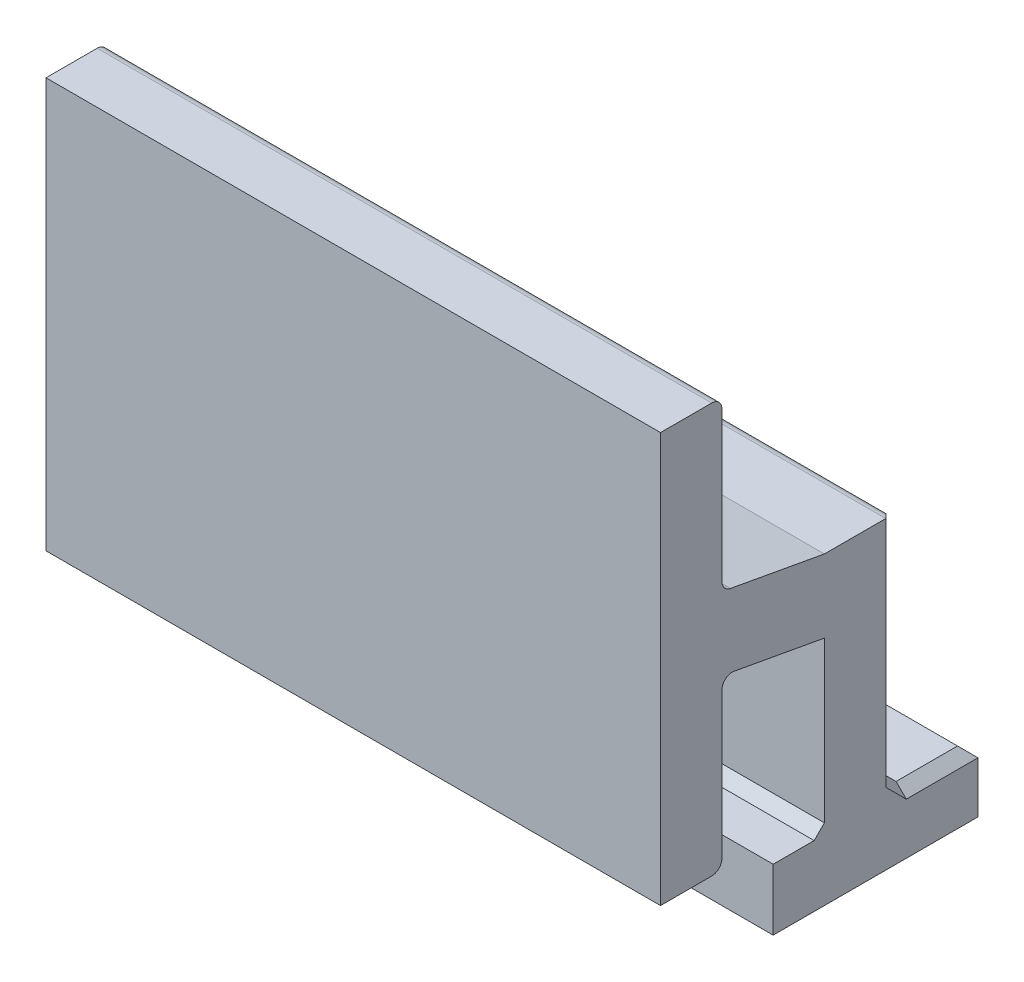
ISO-10303-21;
HEADER;
FILE_DESCRIPTION(('STEP AP214'),'2;1');
FILE_NAME('part.step','',(''),(''),'','','');
FILE_SCHEMA(('AUTOMOTIVE_DESIGN { 1 0 10303 214 1 1 1 1 }'));
ENDSEC;
DATA;
#1=APPLICATION_CONTEXT('core data for automotive mechanical design processes');
#2=APPLICATION_PROTOCOL_DEFINITION('international standard','automotive_design',2000,#1);
#3=PRODUCT_CONTEXT('',#1,'mechanical');
#4=PRODUCT('Part','Part','',(#3));
#5=PRODUCT_RELATED_PRODUCT_CATEGORY('part','',(#4));
#6=PRODUCT_DEFINITION_FORMATION('','',#4);
#7=PRODUCT_DEFINITION_CONTEXT('part definition',#1,'design');
#8=PRODUCT_DEFINITION('design','',#6,#7);
#9=PRODUCT_DEFINITION_SHAPE('','',#8);
#10=(LENGTH_UNIT() NAMED_UNIT(*) SI_UNIT(.MILLI.,.METRE.));
#11=(NAMED_UNIT(*) PLANE_ANGLE_UNIT() SI_UNIT($,.RADIAN.));
#12=(NAMED_UNIT(*) SI_UNIT($,.STERADIAN.) SOLID_ANGLE_UNIT());
#13=UNCERTAINTY_MEASURE_WITH_UNIT(LENGTH_MEASURE(1.E-05),#10,'distance_accuracy_value','');
#14=(GEOMETRIC_REPRESENTATION_CONTEXT(3) GLOBAL_UNCERTAINTY_ASSIGNED_CONTEXT((#13)) GLOBAL_UNIT_ASSIGNED_CONTEXT((#10,
#11,#12)) REPRESENTATION_CONTEXT('',''));
#15=CARTESIAN_POINT('',(0.,0.,0.));
#16=DIRECTION('',(0.,0.,1.));
#17=DIRECTION('',(1.,0.,0.));
#18=AXIS2_PLACEMENT_3D('',#15,#16,#17);
#19=CARTESIAN_POINT('',(30.,0.,5.));
#20=DIRECTION('',(0.,1.,0.));
#21=DIRECTION('',(0.,0.,1.));
#22=AXIS2_PLACEMENT_3D('',#19,#20,#21);
#23=PLANE('',#22);
#24=DIRECTION('',(0.,0.,-1.));
#25=VECTOR('',#24,1.);
#26=CARTESIAN_POINT('',(0.,0.,5.));
#27=LINE('',#26,#25);
#28=CARTESIAN_POINT('',(0.,0.,5.));
#29=VERTEX_POINT('',#28);
#30=CARTESIAN_POINT('',(0.,0.,-5.));
#31=VERTEX_POINT('',#30);
#32=EDGE_CURVE('E239',#29,#31,#27,.T.);
#33=ORIENTED_EDGE('',*,*,#32,.T.);
#34=DIRECTION('',(-1.,0.,0.));
#35=VECTOR('',#34,1.);
#36=CARTESIAN_POINT('',(30.,0.,-5.));
#37=LINE('',#36,#35);
#38=CARTESIAN_POINT('',(30.,0.,-5.));
#39=VERTEX_POINT('',#38);
#40=EDGE_CURVE('E219',#39,#31,#37,.T.);
#41=ORIENTED_EDGE('',*,*,#40,.F.);
#42=DIRECTION('',(0.,0.,-1.));
#43=VECTOR('',#42,1.);
#44=CARTESIAN_POINT('',(30.,0.,5.));
#45=LINE('',#44,#43);
#46=CARTESIAN_POINT('',(30.,0.,5.));
#47=VERTEX_POINT('',#46);
#48=EDGE_CURVE('E226',#47,#39,#45,.T.);
#49=ORIENTED_EDGE('',*,*,#48,.F.);
#50=DIRECTION('',(-1.,0.,0.));
#51=VECTOR('',#50,1.);
#52=CARTESIAN_POINT('',(30.,0.,5.));
#53=LINE('',#52,#51);
#54=EDGE_CURVE('E405',#47,#29,#53,.T.);
#55=ORIENTED_EDGE('',*,*,#54,.T.);
#56=EDGE_LOOP('',(#33,#41,#49,#55));
#57=FACE_BOUND('',#56,.T.);
#58=ADVANCED_FACE('F41',(#57),#23,.F.);
#59=CARTESIAN_POINT('',(30.,3.,-5.));
#60=DIRECTION('',(0.,0.,1.));
#61=DIRECTION('',(1.,0.,0.));
#62=AXIS2_PLACEMENT_3D('',#59,#60,#61);
#63=PLANE('',#62);
#64=DIRECTION('',(0.,1.,0.));
#65=VECTOR('',#64,1.);
#66=CARTESIAN_POINT('',(0.,3.,-5.));
#67=LINE('',#66,#65);
#68=CARTESIAN_POINT('',(0.,2.5,-5.));
#69=VERTEX_POINT('',#68);
#70=EDGE_CURVE('E407',#31,#69,#67,.T.);
#71=ORIENTED_EDGE('',*,*,#70,.T.);
#72=DIRECTION('',(1.,0.,0.));
#73=VECTOR('',#72,1.);
#74=CARTESIAN_POINT('',(30.,2.5,-5.));
#75=LINE('',#74,#73);
#76=CARTESIAN_POINT('',(30.,2.5,-5.));
#77=VERTEX_POINT('',#76);
#78=EDGE_CURVE('E222',#69,#77,#75,.T.);
#79=ORIENTED_EDGE('',*,*,#78,.T.);
#80=DIRECTION('',(0.,1.,0.));
#81=VECTOR('',#80,1.);
#82=CARTESIAN_POINT('',(30.,3.,-5.));
#83=LINE('',#82,#81);
#84=EDGE_CURVE('E214',#39,#77,#83,.T.);
#85=ORIENTED_EDGE('',*,*,#84,.F.);
#86=ORIENTED_EDGE('',*,*,#40,.T.);
#87=EDGE_LOOP('',(#71,#79,#85,#86));
#88=FACE_BOUND('',#87,.T.);
#89=ADVANCED_FACE('F217',(#88),#63,.F.);
#90=CARTESIAN_POINT('',(30.,3.,-1.));
#91=DIRECTION('',(0.,-1.,0.));
#92=DIRECTION('',(0.,0.,-1.));
#93=AXIS2_PLACEMENT_3D('',#90,#91,#92);
#94=PLANE('',#93);
#95=DIRECTION('',(-1.,0.,0.));
#96=VECTOR('',#95,1.);
#97=CARTESIAN_POINT('',(30.,3.,-4.5));
#98=LINE('',#97,#96);
#99=CARTESIAN_POINT('',(29.5,3.,-4.5));
#100=VERTEX_POINT('',#99);
#101=CARTESIAN_POINT('',(0.500000000000004,3.,-4.5));
#102=VERTEX_POINT('',#101);
#103=EDGE_CURVE('E256',#100,#102,#98,.T.);
#104=ORIENTED_EDGE('',*,*,#103,.T.);
#105=DIRECTION('',(0.,0.,1.));
#106=VECTOR('',#105,1.);
#107=CARTESIAN_POINT('',(0.500000000000004,3.,-1.));
#108=LINE('',#107,#106);
#109=CARTESIAN_POINT('',(0.500000000000004,3.,-1.5));
#110=VERTEX_POINT('',#109);
#111=EDGE_CURVE('E258',#102,#110,#108,.T.);
#112=ORIENTED_EDGE('',*,*,#111,.T.);
#113=DIRECTION('',(1.,0.,0.));
#114=VECTOR('',#113,1.);
#115=CARTESIAN_POINT('',(30.,3.,-1.5));
#116=LINE('',#115,#114);
#117=CARTESIAN_POINT('',(29.5,3.,-1.5));
#118=VERTEX_POINT('',#117);
#119=EDGE_CURVE('E252',#110,#118,#116,.T.);
#120=ORIENTED_EDGE('',*,*,#119,.T.);
#121=DIRECTION('',(0.,0.,-1.));
#122=VECTOR('',#121,1.);
#123=CARTESIAN_POINT('',(29.5,3.,-1.));
#124=LINE('',#123,#122);
#125=EDGE_CURVE('E254',#118,#100,#124,.T.);
#126=ORIENTED_EDGE('',*,*,#125,.T.);
#127=EDGE_LOOP('',(#104,#112,#120,#126));
#128=FACE_BOUND('',#127,.T.);
#129=ADVANCED_FACE('F501',(#128),#94,.F.);
#130=CARTESIAN_POINT('',(30.,14.8674074932918,-1.));
#131=DIRECTION('',(0.,0.,1.));
#132=DIRECTION('',(1.,0.,0.));
#133=AXIS2_PLACEMENT_3D('',#130,#131,#132);
#134=PLANE('',#133);
#135=DIRECTION('',(0.,1.,0.));
#136=VECTOR('',#135,1.);
#137=CARTESIAN_POINT('',(0.500000000000004,14.8674074932918,-1.));
#138=LINE('',#137,#136);
#139=CARTESIAN_POINT('',(0.500000000000004,3.5,-1.));
#140=VERTEX_POINT('',#139);
#141=CARTESIAN_POINT('',(0.500000000000004,14.3674074932918,-1.));
#142=VERTEX_POINT('',#141);
#143=EDGE_CURVE('E285',#140,#142,#138,.T.);
#144=ORIENTED_EDGE('',*,*,#143,.T.);
#145=DIRECTION('',(-1.,0.,0.));
#146=VECTOR('',#145,1.);
#147=CARTESIAN_POINT('',(30.,14.3674074932918,-1.));
#148=LINE('',#147,#146);
#149=CARTESIAN_POINT('',(29.5,14.3674074932918,-1.));
#150=VERTEX_POINT('',#149);
#151=EDGE_CURVE('E56',#142,#150,#148,.F.);
#152=ORIENTED_EDGE('',*,*,#151,.T.);
#153=DIRECTION('',(0.,-1.,0.));
#154=VECTOR('',#153,1.);
#155=CARTESIAN_POINT('',(29.5,14.8674074932918,-1.));
#156=LINE('',#155,#154);
#157=CARTESIAN_POINT('',(29.5,3.5,-1.));
#158=VERTEX_POINT('',#157);
#159=EDGE_CURVE('E287',#150,#158,#156,.T.);
#160=ORIENTED_EDGE('',*,*,#159,.T.);
#161=DIRECTION('',(-1.,0.,0.));
#162=VECTOR('',#161,1.);
#163=CARTESIAN_POINT('',(0.,3.5,-1.));
#164=LINE('',#163,#162);
#165=EDGE_CURVE('E283',#158,#140,#164,.T.);
#166=ORIENTED_EDGE('',*,*,#165,.T.);
#167=EDGE_LOOP('',(#144,#152,#160,#166));
#168=FACE_BOUND('',#167,.T.);
#169=ADVANCED_FACE('F600',(#168),#134,.F.);
#170=CARTESIAN_POINT('',(30.,14.8674074932918,2.5));
#171=DIRECTION('',(0.,-1.,0.));
#172=DIRECTION('',(0.,0.,-1.));
#173=AXIS2_PLACEMENT_3D('',#170,#171,#172);
#174=PLANE('',#173);
#175=DIRECTION('',(0.,0.,1.));
#176=VECTOR('',#175,1.);
#177=CARTESIAN_POINT('',(30.,14.8674074932918,2.5));
#178=LINE('',#177,#176);
#179=CARTESIAN_POINT('',(30.,14.8674074932918,-0.499999999999996));
#180=VERTEX_POINT('',#179);
#181=CARTESIAN_POINT('',(30.,14.8674074932918,2.5));
#182=VERTEX_POINT('',#181);
#183=EDGE_CURVE('E225',#180,#182,#178,.T.);
#184=ORIENTED_EDGE('',*,*,#183,.F.);
#185=DIRECTION('',(-1.,0.,0.));
#186=VECTOR('',#185,1.);
#187=CARTESIAN_POINT('',(30.,14.8674074932918,-0.5));
#188=LINE('',#187,#186);
#189=CARTESIAN_POINT('',(0.,14.8674074932918,-0.5));
#190=VERTEX_POINT('',#189);
#191=EDGE_CURVE('E344',#180,#190,#188,.T.);
#192=ORIENTED_EDGE('',*,*,#191,.T.);
#193=DIRECTION('',(0.,0.,1.));
#194=VECTOR('',#193,1.);
#195=CARTESIAN_POINT('',(0.,14.8674074932918,2.5));
#196=LINE('',#195,#194);
#197=CARTESIAN_POINT('',(0.,14.8674074932918,2.5));
#198=VERTEX_POINT('',#197);
#199=EDGE_CURVE('E372',#190,#198,#196,.T.);
#200=ORIENTED_EDGE('',*,*,#199,.T.);
#201=DIRECTION('',(-1.,0.,0.));
#202=VECTOR('',#201,1.);
#203=CARTESIAN_POINT('',(30.,14.8674074932918,2.5));
#204=LINE('',#203,#202);
#205=EDGE_CURVE('E241',#182,#198,#204,.T.);
#206=ORIENTED_EDGE('',*,*,#205,.F.);
#207=EDGE_LOOP('',(#184,#192,#200,#206));
#208=FACE_BOUND('',#207,.T.);
#209=ADVANCED_FACE('F585',(#208),#174,.F.);
#210=CARTESIAN_POINT('',(30.,15.778837040871,7.5));
#211=DIRECTION('',(0.,-0.983788823704256,0.179330840500446));
#212=DIRECTION('',(0.,-0.179330840500446,-0.983788823704256));
#213=AXIS2_PLACEMENT_3D('',#210,#211,#212);
#214=PLANE('',#213);
#215=DIRECTION('',(0.,0.179330840500446,0.983788823704256));
#216=VECTOR('',#215,1.);
#217=CARTESIAN_POINT('',(0.,15.778837040871,7.5));
#218=LINE('',#217,#216);
#219=CARTESIAN_POINT('',(0.,15.7040388287955,7.08966542025022));
#220=VERTEX_POINT('',#219);
#221=EDGE_CURVE('E361',#198,#220,#218,.T.);
#222=ORIENTED_EDGE('',*,*,#221,.T.);
#223=DIRECTION('',(-1.,0.,0.));
#224=VECTOR('',#223,1.);
#225=CARTESIAN_POINT('',(30.,15.7040388287955,7.08966542025022));
#226=LINE('',#225,#224);
#227=CARTESIAN_POINT('',(30.,15.7040388287955,7.08966542025022));
#228=VERTEX_POINT('',#227);
#229=EDGE_CURVE('E342',#220,#228,#226,.F.);
#230=ORIENTED_EDGE('',*,*,#229,.T.);
#231=DIRECTION('',(0.,0.179330840500446,0.983788823704256));
#232=VECTOR('',#231,1.);
#233=CARTESIAN_POINT('',(30.,15.778837040871,7.5));
#234=LINE('',#233,#232);
#235=EDGE_CURVE('E380',#182,#228,#234,.T.);
#236=ORIENTED_EDGE('',*,*,#235,.F.);
#237=ORIENTED_EDGE('',*,*,#205,.T.);
#238=EDGE_LOOP('',(#222,#230,#236,#237));
#239=FACE_BOUND('',#238,.T.);
#240=ADVANCED_FACE('F368',(#239),#214,.F.);
#241=CARTESIAN_POINT('',(30.,24.,7.5));
#242=DIRECTION('',(0.,0.,1.));
#243=DIRECTION('',(1.,0.,0.));
#244=AXIS2_PLACEMENT_3D('',#241,#242,#243);
#245=PLANE('',#244);
#246=DIRECTION('',(0.,1.,0.));
#247=VECTOR('',#246,1.);
#248=CARTESIAN_POINT('',(0.,24.,7.5));
#249=LINE('',#248,#247);
#250=CARTESIAN_POINT('',(0.,16.1959332406476,7.5));
#251=VERTEX_POINT('',#250);
#252=CARTESIAN_POINT('',(0.,23.5,7.5));
#253=VERTEX_POINT('',#252);
#254=EDGE_CURVE('E363',#251,#253,#249,.T.);
#255=ORIENTED_EDGE('',*,*,#254,.T.);
#256=DIRECTION('',(-1.,0.,0.));
#257=VECTOR('',#256,1.);
#258=CARTESIAN_POINT('',(30.,23.5,7.5));
#259=LINE('',#258,#257);
#260=CARTESIAN_POINT('',(30.,23.5,7.5));
#261=VERTEX_POINT('',#260);
#262=EDGE_CURVE('E337',#253,#261,#259,.F.);
#263=ORIENTED_EDGE('',*,*,#262,.T.);
#264=DIRECTION('',(0.,1.,0.));
#265=VECTOR('',#264,1.);
#266=CARTESIAN_POINT('',(30.,24.,7.5));
#267=LINE('',#266,#265);
#268=CARTESIAN_POINT('',(30.,16.1959332406476,7.5));
#269=VERTEX_POINT('',#268);
#270=EDGE_CURVE('E378',#269,#261,#267,.T.);
#271=ORIENTED_EDGE('',*,*,#270,.F.);
#272=DIRECTION('',(-1.,0.,0.));
#273=VECTOR('',#272,1.);
#274=CARTESIAN_POINT('',(0.,16.1959332406476,7.5));
#275=LINE('',#274,#273);
#276=EDGE_CURVE('E334',#269,#251,#275,.T.);
#277=ORIENTED_EDGE('',*,*,#276,.T.);
#278=EDGE_LOOP('',(#255,#263,#271,#277));
#279=FACE_BOUND('',#278,.T.);
#280=ADVANCED_FACE('F382',(#279),#245,.F.);
#281=CARTESIAN_POINT('',(30.,24.,10.5));
#282=DIRECTION('',(0.,-1.,0.));
#283=DIRECTION('',(0.,0.,-1.));
#284=AXIS2_PLACEMENT_3D('',#281,#282,#283);
#285=PLANE('',#284);
#286=DIRECTION('',(0.,0.,1.));
#287=VECTOR('',#286,1.);
#288=CARTESIAN_POINT('',(30.,24.,10.5));
#289=LINE('',#288,#287);
#290=CARTESIAN_POINT('',(30.,24.,8.));
#291=VERTEX_POINT('',#290);
#292=CARTESIAN_POINT('',(30.,24.,10.5));
#293=VERTEX_POINT('',#292);
#294=EDGE_CURVE('E384',#291,#293,#289,.T.);
#295=ORIENTED_EDGE('',*,*,#294,.F.);
#296=DIRECTION('',(-1.,0.,0.));
#297=VECTOR('',#296,1.);
#298=CARTESIAN_POINT('',(30.,24.,8.));
#299=LINE('',#298,#297);
#300=CARTESIAN_POINT('',(0.,24.,8.));
#301=VERTEX_POINT('',#300);
#302=EDGE_CURVE('E331',#291,#301,#299,.T.);
#303=ORIENTED_EDGE('',*,*,#302,.T.);
#304=DIRECTION('',(0.,0.,1.));
#305=VECTOR('',#304,1.);
#306=CARTESIAN_POINT('',(0.,24.,10.5));
#307=LINE('',#306,#305);
#308=CARTESIAN_POINT('',(0.,24.,10.5));
#309=VERTEX_POINT('',#308);
#310=EDGE_CURVE('E411',#301,#309,#307,.T.);
#311=ORIENTED_EDGE('',*,*,#310,.T.);
#312=DIRECTION('',(-1.,0.,0.));
#313=VECTOR('',#312,1.);
#314=CARTESIAN_POINT('',(30.,24.,10.5));
#315=LINE('',#314,#313);
#316=EDGE_CURVE('E247',#293,#309,#315,.T.);
#317=ORIENTED_EDGE('',*,*,#316,.F.);
#318=EDGE_LOOP('',(#295,#303,#311,#317));
#319=FACE_BOUND('',#318,.T.);
#320=ADVANCED_FACE('F613',(#319),#285,.F.);
#321=CARTESIAN_POINT('',(30.,4.,10.5));
#322=DIRECTION('',(0.,0.,-1.));
#323=DIRECTION('',(-1.,0.,0.));
#324=AXIS2_PLACEMENT_3D('',#321,#322,#323);
#325=PLANE('',#324);
#326=DIRECTION('',(0.,-1.,0.));
#327=VECTOR('',#326,1.);
#328=CARTESIAN_POINT('',(0.,4.,10.5));
#329=LINE('',#328,#327);
#330=CARTESIAN_POINT('',(0.,4.,10.5));
#331=VERTEX_POINT('',#330);
#332=EDGE_CURVE('E413',#309,#331,#329,.T.);
#333=ORIENTED_EDGE('',*,*,#332,.T.);
#334=DIRECTION('',(-1.,0.,0.));
#335=VECTOR('',#334,1.);
#336=CARTESIAN_POINT('',(30.,4.,10.5));
#337=LINE('',#336,#335);
#338=CARTESIAN_POINT('',(30.,4.,10.5));
#339=VERTEX_POINT('',#338);
#340=EDGE_CURVE('E436',#339,#331,#337,.T.);
#341=ORIENTED_EDGE('',*,*,#340,.F.);
#342=DIRECTION('',(0.,-1.,0.));
#343=VECTOR('',#342,1.);
#344=CARTESIAN_POINT('',(30.,4.,10.5));
#345=LINE('',#344,#343);
#346=EDGE_CURVE('E386',#293,#339,#345,.T.);
#347=ORIENTED_EDGE('',*,*,#346,.F.);
#348=ORIENTED_EDGE('',*,*,#316,.T.);
#349=EDGE_LOOP('',(#333,#341,#347,#348));
#350=FACE_BOUND('',#349,.T.);
#351=ADVANCED_FACE('F443',(#350),#325,.F.);
#352=CARTESIAN_POINT('',(30.,4.,7.5));
#353=DIRECTION('',(0.,1.,0.));
#354=DIRECTION('',(0.,0.,1.));
#355=AXIS2_PLACEMENT_3D('',#352,#353,#354);
#356=PLANE('',#355);
#357=DIRECTION('',(0.,0.,-1.));
#358=VECTOR('',#357,1.);
#359=CARTESIAN_POINT('',(0.,4.,7.5));
#360=LINE('',#359,#358);
#361=CARTESIAN_POINT('',(0.,4.,8.));
#362=VERTEX_POINT('',#361);
#363=EDGE_CURVE('E415',#331,#362,#360,.T.);
#364=ORIENTED_EDGE('',*,*,#363,.T.);
#365=DIRECTION('',(-1.,0.,0.));
#366=VECTOR('',#365,1.);
#367=CARTESIAN_POINT('',(30.,4.,8.));
#368=LINE('',#367,#366);
#369=CARTESIAN_POINT('',(30.,4.,8.));
#370=VERTEX_POINT('',#369);
#371=EDGE_CURVE('E325',#362,#370,#368,.F.);
#372=ORIENTED_EDGE('',*,*,#371,.T.);
#373=DIRECTION('',(0.,0.,-1.));
#374=VECTOR('',#373,1.);
#375=CARTESIAN_POINT('',(30.,4.,7.5));
#376=LINE('',#375,#374);
#377=EDGE_CURVE('E392',#339,#370,#376,.T.);
#378=ORIENTED_EDGE('',*,*,#377,.F.);
#379=ORIENTED_EDGE('',*,*,#340,.T.);
#380=EDGE_LOOP('',(#364,#372,#378,#379));
#381=FACE_BOUND('',#380,.T.);
#382=ADVANCED_FACE('F451',(#381),#356,.F.);
#383=CARTESIAN_POINT('',(30.,12.221162959129,7.5));
#384=DIRECTION('',(0.,0.,1.));
#385=DIRECTION('',(0.,-1.,0.));
#386=AXIS2_PLACEMENT_3D('',#383,#384,#385);
#387=PLANE('',#386);
#388=DIRECTION('',(0.,1.,0.));
#389=VECTOR('',#388,1.);
#390=CARTESIAN_POINT('',(30.,12.221162959129,7.5));
#391=LINE('',#390,#389);
#392=CARTESIAN_POINT('',(30.,4.5,7.5));
#393=VERTEX_POINT('',#392);
#394=CARTESIAN_POINT('',(30.,11.6217808498366,7.5));
#395=VERTEX_POINT('',#394);
#396=EDGE_CURVE('E394',#393,#395,#391,.T.);
#397=ORIENTED_EDGE('',*,*,#396,.F.);
#398=DIRECTION('',(-1.,0.,0.));
#399=VECTOR('',#398,1.);
#400=CARTESIAN_POINT('',(30.,4.5,7.5));
#401=LINE('',#400,#399);
#402=CARTESIAN_POINT('',(0.,4.5,7.5));
#403=VERTEX_POINT('',#402);
#404=EDGE_CURVE('E318',#393,#403,#401,.T.);
#405=ORIENTED_EDGE('',*,*,#404,.T.);
#406=DIRECTION('',(0.,1.,0.));
#407=VECTOR('',#406,1.);
#408=CARTESIAN_POINT('',(0.,12.221162959129,7.5));
#409=LINE('',#408,#407);
#410=CARTESIAN_POINT('',(0.,11.6217808498366,7.5));
#411=VERTEX_POINT('',#410);
#412=EDGE_CURVE('E418',#403,#411,#409,.T.);
#413=ORIENTED_EDGE('',*,*,#412,.T.);
#414=DIRECTION('',(-1.,0.,0.));
#415=VECTOR('',#414,1.);
#416=CARTESIAN_POINT('',(30.,11.6217808498366,7.5));
#417=LINE('',#416,#415);
#418=EDGE_CURVE('E294',#411,#395,#417,.F.);
#419=ORIENTED_EDGE('',*,*,#418,.T.);
#420=EDGE_LOOP('',(#397,#405,#413,#419));
#421=FACE_BOUND('',#420,.T.);
#422=ADVANCED_FACE('F460',(#421),#387,.F.);
#423=CARTESIAN_POINT('',(30.,11.3097334115499,2.5));
#424=DIRECTION('',(0.,0.983788823704256,-0.179330840500446));
#425=DIRECTION('',(0.,0.179330840500446,0.983788823704256));
#426=AXIS2_PLACEMENT_3D('',#423,#424,#425);
#427=PLANE('',#426);
#428=DIRECTION('',(0.,-0.179330840500446,-0.983788823704256));
#429=VECTOR('',#428,1.);
#430=CARTESIAN_POINT('',(30.,11.3097334115499,2.5));
#431=LINE('',#430,#429);
#432=CARTESIAN_POINT('',(30.,12.1136752616887,6.91033457974978));
#433=VERTEX_POINT('',#432);
#434=CARTESIAN_POINT('',(30.,11.3097334115499,2.5));
#435=VERTEX_POINT('',#434);
#436=EDGE_CURVE('E397',#433,#435,#431,.T.);
#437=ORIENTED_EDGE('',*,*,#436,.F.);
#438=DIRECTION('',(-1.,0.,0.));
#439=VECTOR('',#438,1.);
#440=CARTESIAN_POINT('',(0.,12.1136752616887,6.91033457974978));
#441=LINE('',#440,#439);
#442=CARTESIAN_POINT('',(0.,12.1136752616887,6.91033457974978));
#443=VERTEX_POINT('',#442);
#444=EDGE_CURVE('E339',#433,#443,#441,.T.);
#445=ORIENTED_EDGE('',*,*,#444,.T.);
#446=DIRECTION('',(0.,-0.179330840500446,-0.983788823704256));
#447=VECTOR('',#446,1.);
#448=CARTESIAN_POINT('',(0.,11.3097334115499,2.5));
#449=LINE('',#448,#447);
#450=CARTESIAN_POINT('',(0.,11.3097334115499,2.5));
#451=VERTEX_POINT('',#450);
#452=EDGE_CURVE('E421',#443,#451,#449,.T.);
#453=ORIENTED_EDGE('',*,*,#452,.T.);
#454=DIRECTION('',(-1.,0.,0.));
#455=VECTOR('',#454,1.);
#456=CARTESIAN_POINT('',(30.,11.3097334115499,2.5));
#457=LINE('',#456,#455);
#458=EDGE_CURVE('E433',#435,#451,#457,.T.);
#459=ORIENTED_EDGE('',*,*,#458,.F.);
#460=EDGE_LOOP('',(#437,#445,#453,#459));
#461=FACE_BOUND('',#460,.T.);
#462=ADVANCED_FACE('F468',(#461),#427,.F.);
#463=CARTESIAN_POINT('',(30.,3.,2.5));
#464=DIRECTION('',(0.,0.,-1.));
#465=DIRECTION('',(0.,1.,0.));
#466=AXIS2_PLACEMENT_3D('',#463,#464,#465);
#467=PLANE('',#466);
#468=DIRECTION('',(0.,-1.,0.));
#469=VECTOR('',#468,1.);
#470=CARTESIAN_POINT('',(0.,3.,2.5));
#471=LINE('',#470,#469);
#472=CARTESIAN_POINT('',(0.,3.5,2.5));
#473=VERTEX_POINT('',#472);
#474=EDGE_CURVE('E423',#451,#473,#471,.T.);
#475=ORIENTED_EDGE('',*,*,#474,.T.);
#476=DIRECTION('',(1.,0.,0.));
#477=VECTOR('',#476,1.);
#478=CARTESIAN_POINT('',(30.,3.5,2.5));
#479=LINE('',#478,#477);
#480=CARTESIAN_POINT('',(30.,3.5,2.5));
#481=VERTEX_POINT('',#480);
#482=EDGE_CURVE('E244',#473,#481,#479,.T.);
#483=ORIENTED_EDGE('',*,*,#482,.T.);
#484=DIRECTION('',(0.,-1.,0.));
#485=VECTOR('',#484,1.);
#486=CARTESIAN_POINT('',(30.,3.,2.5));
#487=LINE('',#486,#485);
#488=EDGE_CURVE('E399',#435,#481,#487,.T.);
#489=ORIENTED_EDGE('',*,*,#488,.F.);
#490=ORIENTED_EDGE('',*,*,#458,.T.);
#491=EDGE_LOOP('',(#475,#483,#489,#490));
#492=FACE_BOUND('',#491,.T.);
#493=ADVANCED_FACE('F473',(#492),#467,.F.);
#494=CARTESIAN_POINT('',(30.,3.,5.));
#495=DIRECTION('',(0.,-1.,0.));
#496=DIRECTION('',(0.,0.,-1.));
#497=AXIS2_PLACEMENT_3D('',#494,#495,#496);
#498=PLANE('',#497);
#499=DIRECTION('',(0.,0.,1.));
#500=VECTOR('',#499,1.);
#501=CARTESIAN_POINT('',(30.,3.,5.));
#502=LINE('',#501,#500);
#503=CARTESIAN_POINT('',(30.,3.,3.00000000000001));
#504=VERTEX_POINT('',#503);
#505=CARTESIAN_POINT('',(30.,3.,5.));
#506=VERTEX_POINT('',#505);
#507=EDGE_CURVE('E402',#504,#506,#502,.T.);
#508=ORIENTED_EDGE('',*,*,#507,.F.);
#509=DIRECTION('',(-1.,0.,0.));
#510=VECTOR('',#509,1.);
#511=CARTESIAN_POINT('',(0.,3.,3.00000000000001));
#512=LINE('',#511,#510);
#513=CARTESIAN_POINT('',(0.,3.,3.00000000000001));
#514=VERTEX_POINT('',#513);
#515=EDGE_CURVE('E240',#504,#514,#512,.T.);
#516=ORIENTED_EDGE('',*,*,#515,.T.);
#517=DIRECTION('',(0.,0.,1.));
#518=VECTOR('',#517,1.);
#519=CARTESIAN_POINT('',(0.,3.,5.));
#520=LINE('',#519,#518);
#521=CARTESIAN_POINT('',(0.,3.,5.));
#522=VERTEX_POINT('',#521);
#523=EDGE_CURVE('E426',#514,#522,#520,.T.);
#524=ORIENTED_EDGE('',*,*,#523,.T.);
#525=DIRECTION('',(-1.,0.,0.));
#526=VECTOR('',#525,1.);
#527=CARTESIAN_POINT('',(30.,3.,5.));
#528=LINE('',#527,#526);
#529=EDGE_CURVE('E430',#506,#522,#528,.T.);
#530=ORIENTED_EDGE('',*,*,#529,.F.);
#531=EDGE_LOOP('',(#508,#516,#524,#530));
#532=FACE_BOUND('',#531,.T.);
#533=ADVANCED_FACE('F482',(#532),#498,.F.);
#534=CARTESIAN_POINT('',(30.,0.,5.));
#535=DIRECTION('',(0.,0.,-1.));
#536=DIRECTION('',(-1.,0.,0.));
#537=AXIS2_PLACEMENT_3D('',#534,#535,#536);
#538=PLANE('',#537);
#539=DIRECTION('',(0.,-1.,0.));
#540=VECTOR('',#539,1.);
#541=CARTESIAN_POINT('',(0.,0.,5.));
#542=LINE('',#541,#540);
#543=EDGE_CURVE('E236',#522,#29,#542,.T.);
#544=ORIENTED_EDGE('',*,*,#543,.T.);
#545=ORIENTED_EDGE('',*,*,#54,.F.);
#546=DIRECTION('',(0.,-1.,0.));
#547=VECTOR('',#546,1.);
#548=CARTESIAN_POINT('',(30.,0.,5.));
#549=LINE('',#548,#547);
#550=EDGE_CURVE('E232',#506,#47,#549,.T.);
#551=ORIENTED_EDGE('',*,*,#550,.F.);
#552=ORIENTED_EDGE('',*,*,#529,.T.);
#553=EDGE_LOOP('',(#544,#545,#551,#552));
#554=FACE_BOUND('',#553,.T.);
#555=ADVANCED_FACE('F486',(#554),#538,.F.);
#556=CARTESIAN_POINT('',(30.,0.,0.));
#557=DIRECTION('',(-1.,0.,0.));
#558=DIRECTION('',(0.,0.,1.));
#559=AXIS2_PLACEMENT_3D('',#556,#557,#558);
#560=PLANE('',#559);
#561=ORIENTED_EDGE('',*,*,#377,.T.);
#562=CARTESIAN_POINT('',(30.,4.5,8.));
#563=DIRECTION('',(-1.,0.,0.));
#564=DIRECTION('',(0.,0.,1.));
#565=AXIS2_PLACEMENT_3D('',#562,#563,#564);
#566=CIRCLE('',#565,0.5);
#567=EDGE_CURVE('E329',#370,#393,#566,.F.);
#568=ORIENTED_EDGE('',*,*,#567,.T.);
#569=ORIENTED_EDGE('',*,*,#396,.T.);
#570=CARTESIAN_POINT('',(30.,11.6217808498366,7.));
#571=DIRECTION('',(-1.,0.,0.));
#572=DIRECTION('',(0.,0.,1.));
#573=AXIS2_PLACEMENT_3D('',#570,#571,#572);
#574=CIRCLE('',#573,0.5);
#575=EDGE_CURVE('E353',#395,#433,#574,.T.);
#576=ORIENTED_EDGE('',*,*,#575,.T.);
#577=ORIENTED_EDGE('',*,*,#436,.T.);
#578=ORIENTED_EDGE('',*,*,#488,.T.);
#579=DIRECTION('',(0.,0.707106781186545,-0.70710678118655));
#580=VECTOR('',#579,1.);
#581=CARTESIAN_POINT('',(30.,3.00000000000001,2.99999999999999));
#582=LINE('',#581,#580);
#583=EDGE_CURVE('E292',#481,#504,#582,.F.);
#584=ORIENTED_EDGE('',*,*,#583,.T.);
#585=ORIENTED_EDGE('',*,*,#507,.T.);
#586=ORIENTED_EDGE('',*,*,#550,.T.);
#587=ORIENTED_EDGE('',*,*,#48,.T.);
#588=ORIENTED_EDGE('',*,*,#84,.T.);
#589=DIRECTION('',(0.,0.,1.));
#590=VECTOR('',#589,1.);
#591=CARTESIAN_POINT('',(30.,2.5,0.));
#592=LINE('',#591,#590);
#593=CARTESIAN_POINT('',(30.,2.5,-1.5));
#594=VERTEX_POINT('',#593);
#595=EDGE_CURVE('E278',#77,#594,#592,.T.);
#596=ORIENTED_EDGE('',*,*,#595,.T.);
#597=DIRECTION('',(0.,-0.70710678118655,-0.707106781186545));
#598=VECTOR('',#597,1.);
#599=CARTESIAN_POINT('',(30.,2.5,-1.5));
#600=LINE('',#599,#598);
#601=CARTESIAN_POINT('',(30.,3.,-1.));
#602=VERTEX_POINT('',#601);
#603=EDGE_CURVE('E272',#602,#594,#600,.T.);
#604=ORIENTED_EDGE('',*,*,#603,.F.);
#605=DIRECTION('',(0.,-0.70710678118655,-0.707106781186545));
#606=VECTOR('',#605,1.);
#607=CARTESIAN_POINT('',(30.,2.5,-1.5));
#608=LINE('',#607,#606);
#609=CARTESIAN_POINT('',(30.,3.5,-0.499999999999996));
#610=VERTEX_POINT('',#609);
#611=EDGE_CURVE('E275',#610,#602,#608,.T.);
#612=ORIENTED_EDGE('',*,*,#611,.F.);
#613=DIRECTION('',(0.,1.,0.));
#614=VECTOR('',#613,1.);
#615=CARTESIAN_POINT('',(30.,0.,-0.499999999999996));
#616=LINE('',#615,#614);
#617=EDGE_CURVE('E280',#610,#180,#616,.T.);
#618=ORIENTED_EDGE('',*,*,#617,.T.);
#619=ORIENTED_EDGE('',*,*,#183,.T.);
#620=ORIENTED_EDGE('',*,*,#235,.T.);
#621=CARTESIAN_POINT('',(30.,16.1959332406476,7.));
#622=DIRECTION('',(-1.,0.,0.));
#623=DIRECTION('',(0.,0.,1.));
#624=AXIS2_PLACEMENT_3D('',#621,#622,#623);
#625=CIRCLE('',#624,0.5);
#626=EDGE_CURVE('E12',#228,#269,#625,.T.);
#627=ORIENTED_EDGE('',*,*,#626,.T.);
#628=ORIENTED_EDGE('',*,*,#270,.T.);
#629=CARTESIAN_POINT('',(30.,23.5,8.));
#630=DIRECTION('',(-1.,0.,0.));
#631=DIRECTION('',(0.,0.,1.));
#632=AXIS2_PLACEMENT_3D('',#629,#630,#631);
#633=CIRCLE('',#632,0.5);
#634=EDGE_CURVE('E327',#261,#291,#633,.F.);
#635=ORIENTED_EDGE('',*,*,#634,.T.);
#636=ORIENTED_EDGE('',*,*,#294,.T.);
#637=ORIENTED_EDGE('',*,*,#346,.T.);
#638=EDGE_LOOP('',(#561,#568,#569,#576,#577,#578,#584,#585,#586,#587,#588,#596,#604,#612,#618,
#619,#620,#627,#628,#635,#636,#637));
#639=FACE_BOUND('',#638,.T.);
#640=ADVANCED_FACE('F230',(#639),#560,.F.);
#641=CARTESIAN_POINT('',(0.,0.,0.));
#642=DIRECTION('',(-1.,0.,0.));
#643=DIRECTION('',(0.,0.,1.));
#644=AXIS2_PLACEMENT_3D('',#641,#642,#643);
#645=PLANE('',#644);
#646=ORIENTED_EDGE('',*,*,#412,.F.);
#647=CARTESIAN_POINT('',(0.,4.5,8.));
#648=DIRECTION('',(-1.,0.,0.));
#649=DIRECTION('',(0.,0.,1.));
#650=AXIS2_PLACEMENT_3D('',#647,#648,#649);
#651=CIRCLE('',#650,0.5);
#652=EDGE_CURVE('E323',#403,#362,#651,.T.);
#653=ORIENTED_EDGE('',*,*,#652,.T.);
#654=ORIENTED_EDGE('',*,*,#363,.F.);
#655=ORIENTED_EDGE('',*,*,#332,.F.);
#656=ORIENTED_EDGE('',*,*,#310,.F.);
#657=CARTESIAN_POINT('',(0.,23.5,8.));
#658=DIRECTION('',(-1.,0.,0.));
#659=DIRECTION('',(0.,0.,1.));
#660=AXIS2_PLACEMENT_3D('',#657,#658,#659);
#661=CIRCLE('',#660,0.5);
#662=EDGE_CURVE('E321',#301,#253,#661,.T.);
#663=ORIENTED_EDGE('',*,*,#662,.T.);
#664=ORIENTED_EDGE('',*,*,#254,.F.);
#665=CARTESIAN_POINT('',(0.,16.1959332406476,7.));
#666=DIRECTION('',(-1.,0.,0.));
#667=DIRECTION('',(0.,0.,1.));
#668=AXIS2_PLACEMENT_3D('',#665,#666,#667);
#669=CIRCLE('',#668,0.5);
#670=EDGE_CURVE('E49',#251,#220,#669,.F.);
#671=ORIENTED_EDGE('',*,*,#670,.T.);
#672=ORIENTED_EDGE('',*,*,#221,.F.);
#673=ORIENTED_EDGE('',*,*,#199,.F.);
#674=DIRECTION('',(0.,-1.,0.));
#675=VECTOR('',#674,1.);
#676=CARTESIAN_POINT('',(0.,3.,-0.5));
#677=LINE('',#676,#675);
#678=CARTESIAN_POINT('',(0.,3.5,-0.5));
#679=VERTEX_POINT('',#678);
#680=EDGE_CURVE('E267',#190,#679,#677,.T.);
#681=ORIENTED_EDGE('',*,*,#680,.T.);
#682=DIRECTION('',(0.,0.70710678118655,0.707106781186545));
#683=VECTOR('',#682,1.);
#684=CARTESIAN_POINT('',(0.,1.99999999999999,-2.));
#685=LINE('',#684,#683);
#686=CARTESIAN_POINT('',(0.,3.,-1.));
#687=VERTEX_POINT('',#686);
#688=EDGE_CURVE('E261',#687,#679,#685,.T.);
#689=ORIENTED_EDGE('',*,*,#688,.F.);
#690=DIRECTION('',(0.,0.70710678118655,0.707106781186545));
#691=VECTOR('',#690,1.);
#692=CARTESIAN_POINT('',(0.,1.99999999999999,-2.));
#693=LINE('',#692,#691);
#694=CARTESIAN_POINT('',(0.,2.5,-1.5));
#695=VERTEX_POINT('',#694);
#696=EDGE_CURVE('E264',#695,#687,#693,.T.);
#697=ORIENTED_EDGE('',*,*,#696,.F.);
#698=DIRECTION('',(0.,0.,-1.));
#699=VECTOR('',#698,1.);
#700=CARTESIAN_POINT('',(0.,2.5,-5.));
#701=LINE('',#700,#699);
#702=EDGE_CURVE('E269',#695,#69,#701,.T.);
#703=ORIENTED_EDGE('',*,*,#702,.T.);
#704=ORIENTED_EDGE('',*,*,#70,.F.);
#705=ORIENTED_EDGE('',*,*,#32,.F.);
#706=ORIENTED_EDGE('',*,*,#543,.F.);
#707=ORIENTED_EDGE('',*,*,#523,.F.);
#708=DIRECTION('',(0.,-0.707106781186545,0.70710678118655));
#709=VECTOR('',#708,1.);
#710=CARTESIAN_POINT('',(0.,3.,3.00000000000001));
#711=LINE('',#710,#709);
#712=EDGE_CURVE('E290',#514,#473,#711,.F.);
#713=ORIENTED_EDGE('',*,*,#712,.T.);
#714=ORIENTED_EDGE('',*,*,#474,.F.);
#715=ORIENTED_EDGE('',*,*,#452,.F.);
#716=CARTESIAN_POINT('',(0.,11.6217808498366,7.));
#717=DIRECTION('',(-1.,0.,0.));
#718=DIRECTION('',(0.,0.,1.));
#719=AXIS2_PLACEMENT_3D('',#716,#717,#718);
#720=CIRCLE('',#719,0.5);
#721=EDGE_CURVE('E351',#443,#411,#720,.F.);
#722=ORIENTED_EDGE('',*,*,#721,.T.);
#723=EDGE_LOOP('',(#646,#653,#654,#655,#656,#663,#664,#671,#672,#673,#681,#689,#697,#703,#704,
#705,#706,#707,#713,#714,#715,#722));
#724=FACE_BOUND('',#723,.T.);
#725=ADVANCED_FACE('F359',(#724),#645,.T.);
#726=CARTESIAN_POINT('',(30.,3.,3.00000000000001));
#727=DIRECTION('',(0.,0.70710678118655,0.707106781186545));
#728=DIRECTION('',(1.,0.,0.));
#729=AXIS2_PLACEMENT_3D('',#726,#727,#728);
#730=PLANE('',#729);
#731=ORIENTED_EDGE('',*,*,#583,.F.);
#732=ORIENTED_EDGE('',*,*,#482,.F.);
#733=ORIENTED_EDGE('',*,*,#712,.F.);
#734=ORIENTED_EDGE('',*,*,#515,.F.);
#735=EDGE_LOOP('',(#731,#732,#733,#734));
#736=FACE_BOUND('',#735,.T.);
#737=ADVANCED_FACE('F479',(#736),#730,.T.);
#738=CARTESIAN_POINT('',(30.,0.,-0.499999999999996));
#739=DIRECTION('',(-0.70710678118655,0.,0.707106781186545));
#740=DIRECTION('',(0.,1.,0.));
#741=AXIS2_PLACEMENT_3D('',#738,#739,#740);
#742=PLANE('',#741);
#743=ORIENTED_EDGE('',*,*,#159,.F.);
#744=CARTESIAN_POINT('',(30.,14.3674074932918,-0.5));
#745=DIRECTION('',(-0.70710678118655,0.,0.707106781186545));
#746=DIRECTION('',(-0.707106781186545,0.,-0.70710678118655));
#747=AXIS2_PLACEMENT_3D('',#744,#745,#746);
#748=ELLIPSE('',#747,0.707106781186545,0.5);
#749=EDGE_CURVE('E349',#150,#180,#748,.F.);
#750=ORIENTED_EDGE('',*,*,#749,.T.);
#751=ORIENTED_EDGE('',*,*,#617,.F.);
#752=DIRECTION('',(0.707106781186545,0.,0.70710678118655));
#753=VECTOR('',#752,1.);
#754=CARTESIAN_POINT('',(29.5,3.5,-1.));
#755=LINE('',#754,#753);
#756=EDGE_CURVE('E314',#158,#610,#755,.T.);
#757=ORIENTED_EDGE('',*,*,#756,.F.);
#758=EDGE_LOOP('',(#743,#750,#751,#757));
#759=FACE_BOUND('',#758,.T.);
#760=ADVANCED_FACE('F511',(#759),#742,.F.);
#761=CARTESIAN_POINT('',(29.5,3.,-1.5));
#762=DIRECTION('',(0.577350269189627,0.577350269189623,-0.577350269189627));
#763=DIRECTION('',(-0.707106781186547,0.,-0.707106781186548));
#764=AXIS2_PLACEMENT_3D('',#761,#762,#763);
#765=PLANE('',#764);
#766=ORIENTED_EDGE('',*,*,#611,.T.);
#767=ORIENTED_EDGE('',*,*,#603,.T.);
#768=DIRECTION('',(-0.707106781186545,0.70710678118655,0.));
#769=VECTOR('',#768,1.);
#770=CARTESIAN_POINT('',(30.,2.5,-1.5));
#771=LINE('',#770,#769);
#772=EDGE_CURVE('E311',#118,#594,#771,.F.);
#773=ORIENTED_EDGE('',*,*,#772,.F.);
#774=DIRECTION('',(0.,-0.70710678118655,-0.707106781186545));
#775=VECTOR('',#774,1.);
#776=CARTESIAN_POINT('',(29.5,3.,-1.5));
#777=LINE('',#776,#775);
#778=EDGE_CURVE('E308',#158,#118,#777,.T.);
#779=ORIENTED_EDGE('',*,*,#778,.F.);
#780=ORIENTED_EDGE('',*,*,#756,.T.);
#781=EDGE_LOOP('',(#766,#767,#773,#779,#780));
#782=FACE_BOUND('',#781,.T.);
#783=ADVANCED_FACE('F553',(#782),#765,.T.);
#784=CARTESIAN_POINT('',(30.,2.5,0.));
#785=DIRECTION('',(-0.70710678118655,-0.707106781186545,0.));
#786=DIRECTION('',(0.,0.,1.));
#787=AXIS2_PLACEMENT_3D('',#784,#785,#786);
#788=PLANE('',#787);
#789=ORIENTED_EDGE('',*,*,#772,.T.);
#790=ORIENTED_EDGE('',*,*,#595,.F.);
#791=DIRECTION('',(-0.577350269189624,0.577350269189628,0.577350269189624));
#792=VECTOR('',#791,1.);
#793=CARTESIAN_POINT('',(28.3333333333333,4.16666666666667,-3.33333333333334));
#794=LINE('',#793,#792);
#795=EDGE_CURVE('E305',#100,#77,#794,.F.);
#796=ORIENTED_EDGE('',*,*,#795,.F.);
#797=ORIENTED_EDGE('',*,*,#125,.F.);
#798=EDGE_LOOP('',(#789,#790,#796,#797));
#799=FACE_BOUND('',#798,.T.);
#800=ADVANCED_FACE('F546',(#799),#788,.F.);
#801=CARTESIAN_POINT('',(30.,3.5,-1.));
#802=DIRECTION('',(0.,0.707106781186545,-0.70710678118655));
#803=DIRECTION('',(1.,0.,0.));
#804=AXIS2_PLACEMENT_3D('',#801,#802,#803);
#805=PLANE('',#804);
#806=ORIENTED_EDGE('',*,*,#778,.T.);
#807=ORIENTED_EDGE('',*,*,#119,.F.);
#808=DIRECTION('',(0.,0.70710678118655,0.707106781186545));
#809=VECTOR('',#808,1.);
#810=CARTESIAN_POINT('',(0.500000000000004,3.5,-1.));
#811=LINE('',#810,#809);
#812=EDGE_CURVE('E302',#140,#110,#811,.F.);
#813=ORIENTED_EDGE('',*,*,#812,.F.);
#814=ORIENTED_EDGE('',*,*,#165,.F.);
#815=EDGE_LOOP('',(#806,#807,#813,#814));
#816=FACE_BOUND('',#815,.T.);
#817=ADVANCED_FACE('F540',(#816),#805,.T.);
#818=CARTESIAN_POINT('',(0.500000000000004,14.8674074932918,-1.));
#819=DIRECTION('',(-0.707106781186545,0.,-0.70710678118655));
#820=DIRECTION('',(0.,-1.,0.));
#821=AXIS2_PLACEMENT_3D('',#818,#819,#820);
#822=PLANE('',#821);
#823=ORIENTED_EDGE('',*,*,#680,.F.);
#824=CARTESIAN_POINT('',(0.,14.3674074932918,-0.5));
#825=DIRECTION('',(-0.707106781186545,0.,-0.70710678118655));
#826=DIRECTION('',(-0.70710678118655,0.,0.707106781186545));
#827=AXIS2_PLACEMENT_3D('',#824,#825,#826);
#828=ELLIPSE('',#827,0.70710678118655,0.5);
#829=EDGE_CURVE('E64',#190,#142,#828,.T.);
#830=ORIENTED_EDGE('',*,*,#829,.T.);
#831=ORIENTED_EDGE('',*,*,#143,.F.);
#832=DIRECTION('',(0.70710678118655,0.,-0.707106781186545));
#833=VECTOR('',#832,1.);
#834=CARTESIAN_POINT('',(0.,3.5,-0.5));
#835=LINE('',#834,#833);
#836=EDGE_CURVE('E299',#679,#140,#835,.T.);
#837=ORIENTED_EDGE('',*,*,#836,.F.);
#838=EDGE_LOOP('',(#823,#830,#831,#837));
#839=FACE_BOUND('',#838,.T.);
#840=ADVANCED_FACE('F533',(#839),#822,.T.);
#841=CARTESIAN_POINT('',(30.,3.,-4.5));
#842=DIRECTION('',(0.,-0.707106781186545,0.70710678118655));
#843=DIRECTION('',(-1.,0.,0.));
#844=AXIS2_PLACEMENT_3D('',#841,#842,#843);
#845=PLANE('',#844);
#846=ORIENTED_EDGE('',*,*,#795,.T.);
#847=ORIENTED_EDGE('',*,*,#78,.F.);
#848=DIRECTION('',(-0.57735026918963,-0.577350269189626,-0.577350269189622));
#849=VECTOR('',#848,1.);
#850=CARTESIAN_POINT('',(10.3333333333335,12.8333333333334,5.33333333333333));
#851=LINE('',#850,#849);
#852=EDGE_CURVE('E297',#102,#69,#851,.T.);
#853=ORIENTED_EDGE('',*,*,#852,.F.);
#854=ORIENTED_EDGE('',*,*,#103,.F.);
#855=EDGE_LOOP('',(#846,#847,#853,#854));
#856=FACE_BOUND('',#855,.T.);
#857=ADVANCED_FACE('F526',(#856),#845,.F.);
#858=CARTESIAN_POINT('',(0.500000000000004,3.5,-1.));
#859=DIRECTION('',(-0.577350269189624,0.577350269189625,-0.577350269189629));
#860=DIRECTION('',(0.,0.70710678118655,0.707106781186545));
#861=AXIS2_PLACEMENT_3D('',#858,#859,#860);
#862=PLANE('',#861);
#863=ORIENTED_EDGE('',*,*,#836,.T.);
#864=ORIENTED_EDGE('',*,*,#812,.T.);
#865=DIRECTION('',(-0.70710678118655,-0.707106781186545,0.));
#866=VECTOR('',#865,1.);
#867=CARTESIAN_POINT('',(0.500000000000004,3.,-1.5));
#868=LINE('',#867,#866);
#869=EDGE_CURVE('E295',#695,#110,#868,.F.);
#870=ORIENTED_EDGE('',*,*,#869,.F.);
#871=ORIENTED_EDGE('',*,*,#696,.T.);
#872=ORIENTED_EDGE('',*,*,#688,.T.);
#873=EDGE_LOOP('',(#863,#864,#870,#871,#872));
#874=FACE_BOUND('',#873,.T.);
#875=ADVANCED_FACE('F519',(#874),#862,.T.);
#876=CARTESIAN_POINT('',(0.500000000000004,3.,-1.));
#877=DIRECTION('',(-0.707106781186545,0.70710678118655,0.));
#878=DIRECTION('',(0.,0.,-1.));
#879=AXIS2_PLACEMENT_3D('',#876,#877,#878);
#880=PLANE('',#879);
#881=ORIENTED_EDGE('',*,*,#852,.T.);
#882=ORIENTED_EDGE('',*,*,#702,.F.);
#883=ORIENTED_EDGE('',*,*,#869,.T.);
#884=ORIENTED_EDGE('',*,*,#111,.F.);
#885=EDGE_LOOP('',(#881,#882,#883,#884));
#886=FACE_BOUND('',#885,.T.);
#887=ADVANCED_FACE('F513',(#886),#880,.T.);
#888=CARTESIAN_POINT('',(30.,4.5,8.));
#889=DIRECTION('',(-1.,0.,0.));
#890=DIRECTION('',(0.,0.,1.));
#891=AXIS2_PLACEMENT_3D('',#888,#889,#890);
#892=CYLINDRICAL_SURFACE('',#891,0.5);
#893=ORIENTED_EDGE('',*,*,#567,.F.);
#894=ORIENTED_EDGE('',*,*,#371,.F.);
#895=ORIENTED_EDGE('',*,*,#652,.F.);
#896=ORIENTED_EDGE('',*,*,#404,.F.);
#897=EDGE_LOOP('',(#893,#894,#895,#896));
#898=FACE_BOUND('',#897,.T.);
#899=ADVANCED_FACE('F455',(#898),#892,.T.);
#900=CARTESIAN_POINT('',(30.,23.5,8.));
#901=DIRECTION('',(-1.,0.,0.));
#902=DIRECTION('',(0.,0.,1.));
#903=AXIS2_PLACEMENT_3D('',#900,#901,#902);
#904=CYLINDRICAL_SURFACE('',#903,0.5);
#905=ORIENTED_EDGE('',*,*,#634,.F.);
#906=ORIENTED_EDGE('',*,*,#262,.F.);
#907=ORIENTED_EDGE('',*,*,#662,.F.);
#908=ORIENTED_EDGE('',*,*,#302,.F.);
#909=EDGE_LOOP('',(#905,#906,#907,#908));
#910=FACE_BOUND('',#909,.T.);
#911=ADVANCED_FACE('F567',(#910),#904,.T.);
#912=CARTESIAN_POINT('',(30.,11.6217808498366,7.));
#913=DIRECTION('',(1.,0.,0.));
#914=DIRECTION('',(0.,0.,-1.));
#915=AXIS2_PLACEMENT_3D('',#912,#913,#914);
#916=CYLINDRICAL_SURFACE('',#915,0.5);
#917=ORIENTED_EDGE('',*,*,#575,.F.);
#918=ORIENTED_EDGE('',*,*,#418,.F.);
#919=ORIENTED_EDGE('',*,*,#721,.F.);
#920=ORIENTED_EDGE('',*,*,#444,.F.);
#921=EDGE_LOOP('',(#917,#918,#919,#920));
#922=FACE_BOUND('',#921,.T.);
#923=ADVANCED_FACE('F463',(#922),#916,.F.);
#924=CARTESIAN_POINT('',(30.,16.1959332406476,7.));
#925=DIRECTION('',(1.,0.,0.));
#926=DIRECTION('',(0.,0.,-1.));
#927=AXIS2_PLACEMENT_3D('',#924,#925,#926);
#928=CYLINDRICAL_SURFACE('',#927,0.5);
#929=ORIENTED_EDGE('',*,*,#626,.F.);
#930=ORIENTED_EDGE('',*,*,#229,.F.);
#931=ORIENTED_EDGE('',*,*,#670,.F.);
#932=ORIENTED_EDGE('',*,*,#276,.F.);
#933=EDGE_LOOP('',(#929,#930,#931,#932));
#934=FACE_BOUND('',#933,.T.);
#935=ADVANCED_FACE('F375',(#934),#928,.F.);
#936=CARTESIAN_POINT('',(30.,14.3674074932918,-0.5));
#937=DIRECTION('',(-1.,0.,0.));
#938=DIRECTION('',(0.,0.,1.));
#939=AXIS2_PLACEMENT_3D('',#936,#937,#938);
#940=CYLINDRICAL_SURFACE('',#939,0.5);
#941=ORIENTED_EDGE('',*,*,#749,.F.);
#942=ORIENTED_EDGE('',*,*,#151,.F.);
#943=ORIENTED_EDGE('',*,*,#829,.F.);
#944=ORIENTED_EDGE('',*,*,#191,.F.);
#945=EDGE_LOOP('',(#941,#942,#943,#944));
#946=FACE_BOUND('',#945,.T.);
#947=ADVANCED_FACE('F43',(#946),#940,.T.);
#948=CLOSED_SHELL('',(#58,#89,#129,#169,#209,#240,#280,#320,#351,#382,#422,#462,#493,#533,#555,
#640,#725,#737,#760,#783,#800,#817,#840,#857,#875,#887,#899,#911,#923,#935,#947));
#949=MANIFOLD_SOLID_BREP('B2',#948);
#950=ADVANCED_BREP_SHAPE_REPRESENTATION('',(#18,#949),#14);
#951=SHAPE_DEFINITION_REPRESENTATION(#9,#950);
ENDSEC;
END-ISO-10303-21;
